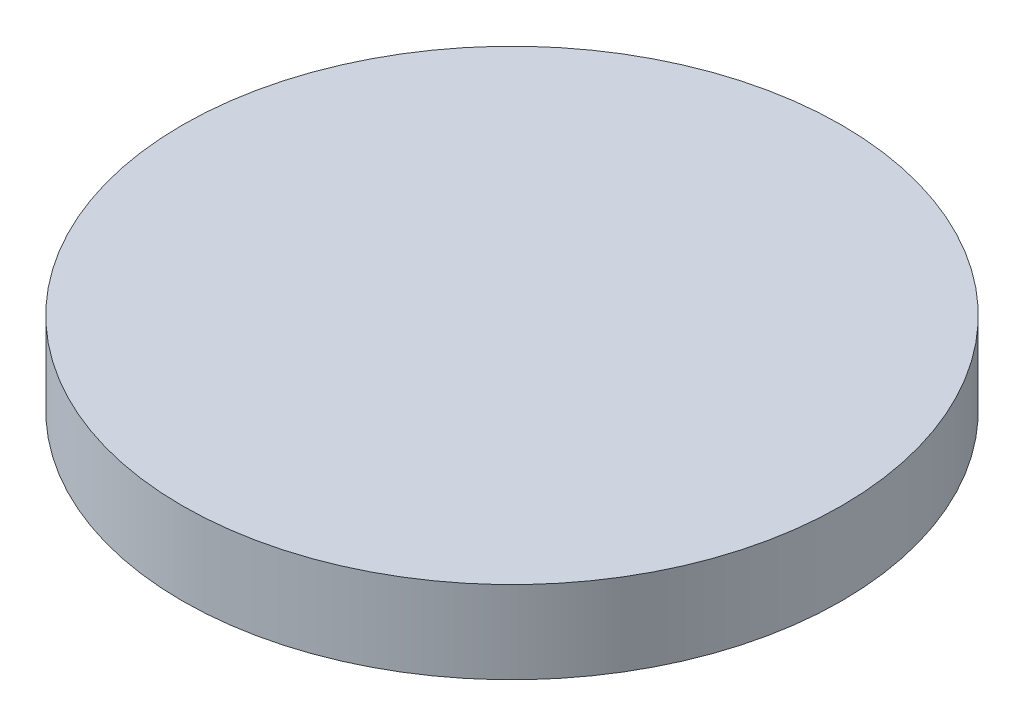
ISO-10303-21;
HEADER;
FILE_DESCRIPTION(('STEP AP214'),'2;1');
FILE_NAME('part.step','',(''),(''),'','','');
FILE_SCHEMA(('AUTOMOTIVE_DESIGN { 1 0 10303 214 1 1 1 1 }'));
ENDSEC;
DATA;
#1=APPLICATION_CONTEXT('core data for automotive mechanical design processes');
#2=APPLICATION_PROTOCOL_DEFINITION('international standard','automotive_design',2000,#1);
#3=PRODUCT_CONTEXT('',#1,'mechanical');
#4=PRODUCT('Part','Part','',(#3));
#5=PRODUCT_RELATED_PRODUCT_CATEGORY('part','',(#4));
#6=PRODUCT_DEFINITION_FORMATION('','',#4);
#7=PRODUCT_DEFINITION_CONTEXT('part definition',#1,'design');
#8=PRODUCT_DEFINITION('design','',#6,#7);
#9=PRODUCT_DEFINITION_SHAPE('','',#8);
#10=(LENGTH_UNIT() NAMED_UNIT(*) SI_UNIT(.MILLI.,.METRE.));
#11=(NAMED_UNIT(*) PLANE_ANGLE_UNIT() SI_UNIT($,.RADIAN.));
#12=(NAMED_UNIT(*) SI_UNIT($,.STERADIAN.) SOLID_ANGLE_UNIT());
#13=UNCERTAINTY_MEASURE_WITH_UNIT(LENGTH_MEASURE(1.E-05),#10,'distance_accuracy_value','');
#14=(GEOMETRIC_REPRESENTATION_CONTEXT(3) GLOBAL_UNCERTAINTY_ASSIGNED_CONTEXT((#13)) GLOBAL_UNIT_ASSIGNED_CONTEXT((#10,
#11,#12)) REPRESENTATION_CONTEXT('',''));
#15=CARTESIAN_POINT('',(0.,0.,0.));
#16=DIRECTION('',(0.,0.,1.));
#17=DIRECTION('',(1.,0.,0.));
#18=AXIS2_PLACEMENT_3D('',#15,#16,#17);
#19=CARTESIAN_POINT('',(0.,25.4,0.));
#20=DIRECTION('',(0.,-1.,0.));
#21=DIRECTION('',(0.,0.,-1.));
#22=AXIS2_PLACEMENT_3D('',#19,#20,#21);
#23=CYLINDRICAL_SURFACE('',#22,101.6);
#24=CARTESIAN_POINT('',(0.,25.4,0.));
#25=DIRECTION('',(0.,1.,0.));
#26=DIRECTION('',(0.,0.,1.));
#27=AXIS2_PLACEMENT_3D('',#24,#25,#26);
#28=CIRCLE('',#27,101.6);
#29=CARTESIAN_POINT('',(0.,25.4,101.6));
#30=VERTEX_POINT('',#29);
#31=EDGE_CURVE('E53',#30,#30,#28,.T.);
#32=ORIENTED_EDGE('',*,*,#31,.F.);
#33=EDGE_LOOP('',(#32));
#34=FACE_BOUND('',#33,.T.);
#35=CARTESIAN_POINT('',(0.,0.,0.));
#36=DIRECTION('',(0.,1.,0.));
#37=DIRECTION('',(0.,0.,1.));
#38=AXIS2_PLACEMENT_3D('',#35,#36,#37);
#39=CIRCLE('',#38,101.6);
#40=CARTESIAN_POINT('',(0.,0.,101.6));
#41=VERTEX_POINT('',#40);
#42=EDGE_CURVE('E48',#41,#41,#39,.T.);
#43=ORIENTED_EDGE('',*,*,#42,.T.);
#44=EDGE_LOOP('',(#43));
#45=FACE_BOUND('',#44,.T.);
#46=ADVANCED_FACE('F45',(#34,#45),#23,.T.);
#47=CARTESIAN_POINT('',(0.,25.4,0.));
#48=DIRECTION('',(0.,1.,0.));
#49=DIRECTION('',(0.,0.,1.));
#50=AXIS2_PLACEMENT_3D('',#47,#48,#49);
#51=PLANE('',#50);
#52=ORIENTED_EDGE('',*,*,#31,.T.);
#53=EDGE_LOOP('',(#52));
#54=FACE_BOUND('',#53,.T.);
#55=ADVANCED_FACE('F93',(#54),#51,.T.);
#56=CARTESIAN_POINT('',(0.,0.,0.));
#57=DIRECTION('',(0.,1.,0.));
#58=DIRECTION('',(0.,0.,1.));
#59=AXIS2_PLACEMENT_3D('',#56,#57,#58);
#60=PLANE('',#59);
#61=CARTESIAN_POINT('',(0.,0.,0.));
#62=DIRECTION('',(0.,-1.,0.));
#63=DIRECTION('',(0.,0.,-1.));
#64=AXIS2_PLACEMENT_3D('',#61,#62,#63);
#65=CIRCLE('',#64,19.05);
#66=CARTESIAN_POINT('',(0.,0.,-19.05));
#67=VERTEX_POINT('',#66);
#68=EDGE_CURVE('E10',#67,#67,#65,.T.);
#69=ORIENTED_EDGE('',*,*,#68,.F.);
#70=EDGE_LOOP('',(#69));
#71=FACE_BOUND('',#70,.T.);
#72=ORIENTED_EDGE('',*,*,#42,.F.);
#73=EDGE_LOOP('',(#72));
#74=FACE_BOUND('',#73,.T.);
#75=ADVANCED_FACE('F89',(#71,#74),#60,.F.);
#76=CARTESIAN_POINT('',(0.,-50.8,0.));
#77=DIRECTION('',(0.,1.,0.));
#78=DIRECTION('',(0.,0.,1.));
#79=AXIS2_PLACEMENT_3D('',#76,#77,#78);
#80=CYLINDRICAL_SURFACE('',#79,19.05);
#81=CARTESIAN_POINT('',(0.,-50.8,0.));
#82=DIRECTION('',(0.,-1.,0.));
#83=DIRECTION('',(0.,0.,-1.));
#84=AXIS2_PLACEMENT_3D('',#81,#82,#83);
#85=CIRCLE('',#84,19.05);
#86=CARTESIAN_POINT('',(0.,-50.8,-19.05));
#87=VERTEX_POINT('',#86);
#88=EDGE_CURVE('E60',#87,#87,#85,.T.);
#89=ORIENTED_EDGE('',*,*,#88,.F.);
#90=EDGE_LOOP('',(#89));
#91=FACE_BOUND('',#90,.T.);
#92=ORIENTED_EDGE('',*,*,#68,.T.);
#93=EDGE_LOOP('',(#92));
#94=FACE_BOUND('',#93,.T.);
#95=ADVANCED_FACE('F84',(#91,#94),#80,.T.);
#96=CARTESIAN_POINT('',(0.,-50.8,0.));
#97=DIRECTION('',(0.,-1.,0.));
#98=DIRECTION('',(0.,0.,-1.));
#99=AXIS2_PLACEMENT_3D('',#96,#97,#98);
#100=PLANE('',#99);
#101=CARTESIAN_POINT('',(0.,-50.8,0.));
#102=DIRECTION('',(0.,-1.,0.));
#103=DIRECTION('',(0.,0.,-1.));
#104=AXIS2_PLACEMENT_3D('',#101,#102,#103);
#105=CIRCLE('',#104,12.7);
#106=CARTESIAN_POINT('',(0.,-50.8,-12.7));
#107=VERTEX_POINT('',#106);
#108=EDGE_CURVE('E65',#107,#107,#105,.T.);
#109=ORIENTED_EDGE('',*,*,#108,.F.);
#110=EDGE_LOOP('',(#109));
#111=FACE_BOUND('',#110,.T.);
#112=ORIENTED_EDGE('',*,*,#88,.T.);
#113=EDGE_LOOP('',(#112));
#114=FACE_BOUND('',#113,.T.);
#115=ADVANCED_FACE('F78',(#111,#114),#100,.T.);
#116=CARTESIAN_POINT('',(0.,0.,0.));
#117=DIRECTION('',(0.,-1.,0.));
#118=DIRECTION('',(0.,0.,-1.));
#119=AXIS2_PLACEMENT_3D('',#116,#117,#118);
#120=CYLINDRICAL_SURFACE('',#119,12.7);
#121=CARTESIAN_POINT('',(0.,0.,0.));
#122=DIRECTION('',(0.,-1.,0.));
#123=DIRECTION('',(0.,0.,-1.));
#124=AXIS2_PLACEMENT_3D('',#121,#122,#123);
#125=CIRCLE('',#124,12.7);
#126=CARTESIAN_POINT('',(0.,0.,-12.7));
#127=VERTEX_POINT('',#126);
#128=EDGE_CURVE('E64',#127,#127,#125,.T.);
#129=ORIENTED_EDGE('',*,*,#128,.F.);
#130=EDGE_LOOP('',(#129));
#131=FACE_BOUND('',#130,.T.);
#132=ORIENTED_EDGE('',*,*,#108,.T.);
#133=EDGE_LOOP('',(#132));
#134=FACE_BOUND('',#133,.T.);
#135=ADVANCED_FACE('F75',(#131,#134),#120,.F.);
#136=CARTESIAN_POINT('',(0.,0.,0.));
#137=DIRECTION('',(0.,-1.,0.));
#138=DIRECTION('',(0.,0.,-1.));
#139=AXIS2_PLACEMENT_3D('',#136,#137,#138);
#140=PLANE('',#139);
#141=ORIENTED_EDGE('',*,*,#128,.T.);
#142=EDGE_LOOP('',(#141));
#143=FACE_BOUND('',#142,.T.);
#144=ADVANCED_FACE('F73',(#143),#140,.T.);
#145=CLOSED_SHELL('',(#46,#55,#75,#95,#115,#135,#144));
#146=MANIFOLD_SOLID_BREP('B2',#145);
#147=ADVANCED_BREP_SHAPE_REPRESENTATION('',(#18,#146),#14);
#148=SHAPE_DEFINITION_REPRESENTATION(#9,#147);
ENDSEC;
END-ISO-10303-21;
